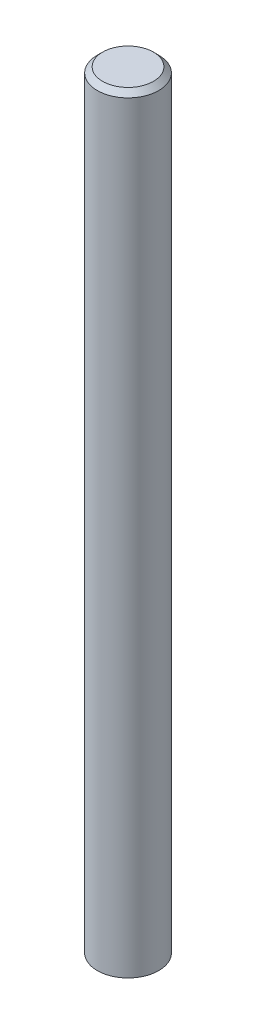
ISO-10303-21;
HEADER;
FILE_DESCRIPTION(('STEP AP214'),'2;1');
FILE_NAME('part.step','',(''),(''),'','','');
FILE_SCHEMA(('AUTOMOTIVE_DESIGN { 1 0 10303 214 1 1 1 1 }'));
ENDSEC;
DATA;
#1=APPLICATION_CONTEXT('core data for automotive mechanical design processes');
#2=APPLICATION_PROTOCOL_DEFINITION('international standard','automotive_design',2000,#1);
#3=PRODUCT_CONTEXT('',#1,'mechanical');
#4=PRODUCT('Part','Part','',(#3));
#5=PRODUCT_RELATED_PRODUCT_CATEGORY('part','',(#4));
#6=PRODUCT_DEFINITION_FORMATION('','',#4);
#7=PRODUCT_DEFINITION_CONTEXT('part definition',#1,'design');
#8=PRODUCT_DEFINITION('design','',#6,#7);
#9=PRODUCT_DEFINITION_SHAPE('','',#8);
#10=(LENGTH_UNIT() NAMED_UNIT(*) SI_UNIT(.MILLI.,.METRE.));
#11=(NAMED_UNIT(*) PLANE_ANGLE_UNIT() SI_UNIT($,.RADIAN.));
#12=(NAMED_UNIT(*) SI_UNIT($,.STERADIAN.) SOLID_ANGLE_UNIT());
#13=UNCERTAINTY_MEASURE_WITH_UNIT(LENGTH_MEASURE(1.E-05),#10,'distance_accuracy_value','');
#14=(GEOMETRIC_REPRESENTATION_CONTEXT(3) GLOBAL_UNCERTAINTY_ASSIGNED_CONTEXT((#13)) GLOBAL_UNIT_ASSIGNED_CONTEXT((#10,
#11,#12)) REPRESENTATION_CONTEXT('',''));
#15=CARTESIAN_POINT('',(0.,0.,0.));
#16=DIRECTION('',(0.,0.,1.));
#17=DIRECTION('',(1.,0.,0.));
#18=AXIS2_PLACEMENT_3D('',#15,#16,#17);
#19=CARTESIAN_POINT('',(0.,100.,0.));
#20=DIRECTION('',(0.,-1.,0.));
#21=DIRECTION('',(0.,0.,-1.));
#22=AXIS2_PLACEMENT_3D('',#19,#20,#21);
#23=CYLINDRICAL_SURFACE('',#22,4.);
#24=CARTESIAN_POINT('',(0.,99.3095,0.));
#25=DIRECTION('',(0.,-1.,0.));
#26=DIRECTION('',(0.,0.,-1.));
#27=AXIS2_PLACEMENT_3D('',#24,#25,#26);
#28=CIRCLE('',#27,4.);
#29=CARTESIAN_POINT('',(0.,99.3095,-4.));
#30=VERTEX_POINT('',#29);
#31=EDGE_CURVE('E47',#30,#30,#28,.T.);
#32=ORIENTED_EDGE('',*,*,#31,.T.);
#33=EDGE_LOOP('',(#32));
#34=FACE_BOUND('',#33,.T.);
#35=CARTESIAN_POINT('',(0.,0.,0.));
#36=DIRECTION('',(0.,1.,0.));
#37=DIRECTION('',(0.,0.,1.));
#38=AXIS2_PLACEMENT_3D('',#35,#36,#37);
#39=CIRCLE('',#38,4.);
#40=CARTESIAN_POINT('',(0.,0.,4.));
#41=VERTEX_POINT('',#40);
#42=EDGE_CURVE('E10',#41,#41,#39,.T.);
#43=ORIENTED_EDGE('',*,*,#42,.T.);
#44=EDGE_LOOP('',(#43));
#45=FACE_BOUND('',#44,.T.);
#46=ADVANCED_FACE('F41',(#34,#45),#23,.T.);
#47=CARTESIAN_POINT('',(0.,0.,0.));
#48=DIRECTION('',(0.,1.,0.));
#49=DIRECTION('',(0.,0.,1.));
#50=AXIS2_PLACEMENT_3D('',#47,#48,#49);
#51=PLANE('',#50);
#52=ORIENTED_EDGE('',*,*,#42,.F.);
#53=EDGE_LOOP('',(#52));
#54=FACE_BOUND('',#53,.T.);
#55=ADVANCED_FACE('F66',(#54),#51,.F.);
#56=CARTESIAN_POINT('',(0.,100.,0.));
#57=DIRECTION('',(0.,-1.,0.));
#58=DIRECTION('',(0.,0.,-1.));
#59=AXIS2_PLACEMENT_3D('',#56,#57,#58);
#60=CONICAL_SURFACE('',#59,3.3095,0.785398163397458);
#61=ORIENTED_EDGE('',*,*,#31,.F.);
#62=EDGE_LOOP('',(#61));
#63=FACE_BOUND('',#62,.T.);
#64=CARTESIAN_POINT('',(0.,100.,0.));
#65=DIRECTION('',(0.,-1.,0.));
#66=DIRECTION('',(0.,0.,-1.));
#67=AXIS2_PLACEMENT_3D('',#64,#65,#66);
#68=CIRCLE('',#67,3.3095);
#69=CARTESIAN_POINT('',(0.,100.,-3.3095));
#70=VERTEX_POINT('',#69);
#71=EDGE_CURVE('E51',#70,#70,#68,.T.);
#72=ORIENTED_EDGE('',*,*,#71,.T.);
#73=EDGE_LOOP('',(#72));
#74=FACE_BOUND('',#73,.T.);
#75=ADVANCED_FACE('F58',(#63,#74),#60,.T.);
#76=CARTESIAN_POINT('',(0.,100.,0.));
#77=DIRECTION('',(0.,1.,0.));
#78=DIRECTION('',(0.,0.,1.));
#79=AXIS2_PLACEMENT_3D('',#76,#77,#78);
#80=PLANE('',#79);
#81=ORIENTED_EDGE('',*,*,#71,.F.);
#82=EDGE_LOOP('',(#81));
#83=FACE_BOUND('',#82,.T.);
#84=ADVANCED_FACE('F60',(#83),#80,.T.);
#85=CLOSED_SHELL('',(#46,#55,#75,#84));
#86=MANIFOLD_SOLID_BREP('B2',#85);
#87=ADVANCED_BREP_SHAPE_REPRESENTATION('',(#18,#86),#14);
#88=SHAPE_DEFINITION_REPRESENTATION(#9,#87);
ENDSEC;
END-ISO-10303-21;
